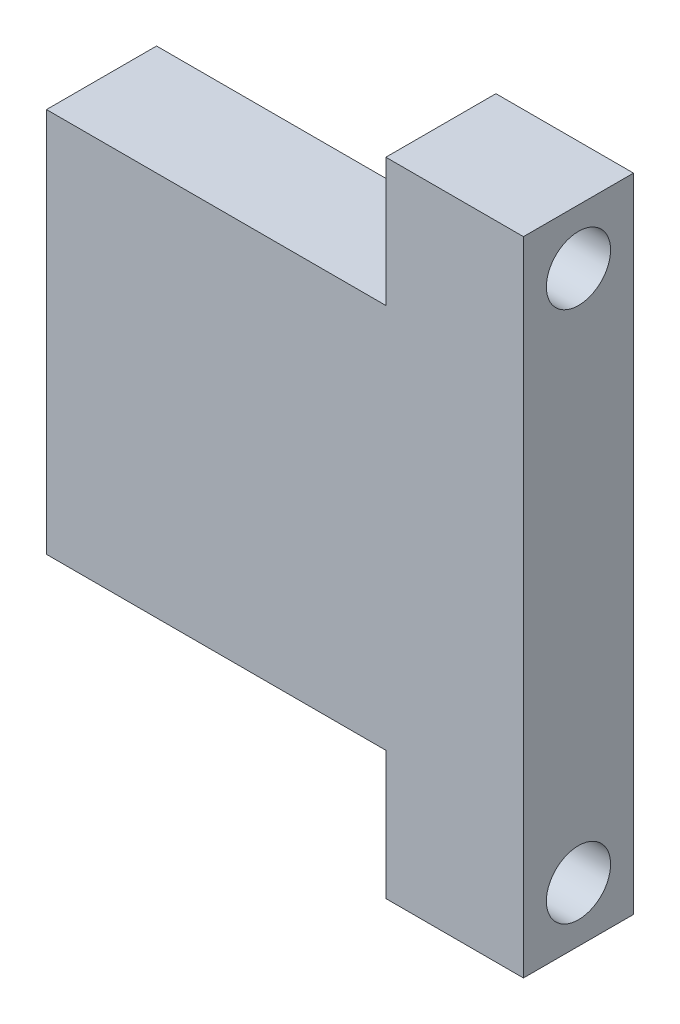
ISO-10303-21;
HEADER;
FILE_DESCRIPTION(('STEP AP214'),'2;1');
FILE_NAME('part.step','',(''),(''),'','','');
FILE_SCHEMA(('AUTOMOTIVE_DESIGN { 1 0 10303 214 1 1 1 1 }'));
ENDSEC;
DATA;
#1=APPLICATION_CONTEXT('core data for automotive mechanical design processes');
#2=APPLICATION_PROTOCOL_DEFINITION('international standard','automotive_design',2000,#1);
#3=PRODUCT_CONTEXT('',#1,'mechanical');
#4=PRODUCT('Part','Part','',(#3));
#5=PRODUCT_RELATED_PRODUCT_CATEGORY('part','',(#4));
#6=PRODUCT_DEFINITION_FORMATION('','',#4);
#7=PRODUCT_DEFINITION_CONTEXT('part definition',#1,'design');
#8=PRODUCT_DEFINITION('design','',#6,#7);
#9=PRODUCT_DEFINITION_SHAPE('','',#8);
#10=(LENGTH_UNIT() NAMED_UNIT(*) SI_UNIT(.MILLI.,.METRE.));
#11=(NAMED_UNIT(*) PLANE_ANGLE_UNIT() SI_UNIT($,.RADIAN.));
#12=(NAMED_UNIT(*) SI_UNIT($,.STERADIAN.) SOLID_ANGLE_UNIT());
#13=UNCERTAINTY_MEASURE_WITH_UNIT(LENGTH_MEASURE(1.E-05),#10,'distance_accuracy_value','');
#14=(GEOMETRIC_REPRESENTATION_CONTEXT(3) GLOBAL_UNCERTAINTY_ASSIGNED_CONTEXT((#13)) GLOBAL_UNIT_ASSIGNED_CONTEXT((#10,
#11,#12)) REPRESENTATION_CONTEXT('',''));
#15=CARTESIAN_POINT('',(0.,0.,0.));
#16=DIRECTION('',(0.,0.,1.));
#17=DIRECTION('',(1.,0.,0.));
#18=AXIS2_PLACEMENT_3D('',#15,#16,#17);
#19=CARTESIAN_POINT('',(0.,-35.,-12.));
#20=DIRECTION('',(1.,0.,0.));
#21=DIRECTION('',(0.,0.,-1.));
#22=AXIS2_PLACEMENT_3D('',#19,#20,#21);
#23=PLANE('',#22);
#24=CARTESIAN_POINT('',(0.,29.,-6.));
#25=DIRECTION('',(1.,0.,0.));
#26=DIRECTION('',(0.,0.,-1.));
#27=AXIS2_PLACEMENT_3D('',#24,#25,#26);
#28=CIRCLE('',#27,3.49999999999999);
#29=CARTESIAN_POINT('',(0.,29.,-9.49999999999999));
#30=VERTEX_POINT('',#29);
#31=EDGE_CURVE('E39',#30,#30,#28,.T.);
#32=ORIENTED_EDGE('',*,*,#31,.F.);
#33=EDGE_LOOP('',(#32));
#34=FACE_BOUND('',#33,.T.);
#35=CARTESIAN_POINT('',(0.,-29.,-6.));
#36=DIRECTION('',(1.,0.,0.));
#37=DIRECTION('',(0.,0.,-1.));
#38=AXIS2_PLACEMENT_3D('',#35,#36,#37);
#39=CIRCLE('',#38,3.49999999999999);
#40=CARTESIAN_POINT('',(0.,-29.,-9.49999999999999));
#41=VERTEX_POINT('',#40);
#42=EDGE_CURVE('E135',#41,#41,#39,.T.);
#43=ORIENTED_EDGE('',*,*,#42,.F.);
#44=EDGE_LOOP('',(#43));
#45=FACE_BOUND('',#44,.T.);
#46=DIRECTION('',(0.,1.,0.));
#47=VECTOR('',#46,1.);
#48=CARTESIAN_POINT('',(0.,-35.,0.));
#49=LINE('',#48,#47);
#50=CARTESIAN_POINT('',(0.,-35.,0.));
#51=VERTEX_POINT('',#50);
#52=CARTESIAN_POINT('',(0.,35.,0.));
#53=VERTEX_POINT('',#52);
#54=EDGE_CURVE('E167',#51,#53,#49,.T.);
#55=ORIENTED_EDGE('',*,*,#54,.F.);
#56=DIRECTION('',(0.,0.,1.));
#57=VECTOR('',#56,1.);
#58=CARTESIAN_POINT('',(0.,-35.,-12.));
#59=LINE('',#58,#57);
#60=CARTESIAN_POINT('',(0.,-35.,-12.));
#61=VERTEX_POINT('',#60);
#62=EDGE_CURVE('E11',#61,#51,#59,.T.);
#63=ORIENTED_EDGE('',*,*,#62,.F.);
#64=DIRECTION('',(0.,1.,0.));
#65=VECTOR('',#64,1.);
#66=CARTESIAN_POINT('',(0.,-35.,-12.));
#67=LINE('',#66,#65);
#68=CARTESIAN_POINT('',(0.,35.,-12.));
#69=VERTEX_POINT('',#68);
#70=EDGE_CURVE('E171',#61,#69,#67,.T.);
#71=ORIENTED_EDGE('',*,*,#70,.T.);
#72=DIRECTION('',(0.,0.,1.));
#73=VECTOR('',#72,1.);
#74=CARTESIAN_POINT('',(0.,35.,-12.));
#75=LINE('',#74,#73);
#76=EDGE_CURVE('E44',#69,#53,#75,.T.);
#77=ORIENTED_EDGE('',*,*,#76,.T.);
#78=EDGE_LOOP('',(#55,#63,#71,#77));
#79=FACE_BOUND('',#78,.T.);
#80=ADVANCED_FACE('F36',(#34,#45,#79),#23,.T.);
#81=CARTESIAN_POINT('',(0.,-35.,-12.));
#82=DIRECTION('',(0.,-1.,0.));
#83=DIRECTION('',(1.,0.,0.));
#84=AXIS2_PLACEMENT_3D('',#81,#82,#83);
#85=PLANE('',#84);
#86=DIRECTION('',(0.,0.,1.));
#87=VECTOR('',#86,1.);
#88=CARTESIAN_POINT('',(-15.,-35.,-12.));
#89=LINE('',#88,#87);
#90=CARTESIAN_POINT('',(-15.,-35.,-12.));
#91=VERTEX_POINT('',#90);
#92=CARTESIAN_POINT('',(-15.,-35.,0.));
#93=VERTEX_POINT('',#92);
#94=EDGE_CURVE('E52',#91,#93,#89,.T.);
#95=ORIENTED_EDGE('',*,*,#94,.F.);
#96=DIRECTION('',(1.,0.,0.));
#97=VECTOR('',#96,1.);
#98=CARTESIAN_POINT('',(0.,-35.,-12.));
#99=LINE('',#98,#97);
#100=EDGE_CURVE('E181',#91,#61,#99,.T.);
#101=ORIENTED_EDGE('',*,*,#100,.T.);
#102=ORIENTED_EDGE('',*,*,#62,.T.);
#103=DIRECTION('',(1.,0.,0.));
#104=VECTOR('',#103,1.);
#105=CARTESIAN_POINT('',(0.,-35.,0.));
#106=LINE('',#105,#104);
#107=EDGE_CURVE('E175',#93,#51,#106,.T.);
#108=ORIENTED_EDGE('',*,*,#107,.F.);
#109=EDGE_LOOP('',(#95,#101,#102,#108));
#110=FACE_BOUND('',#109,.T.);
#111=ADVANCED_FACE('F205',(#110),#85,.T.);
#112=CARTESIAN_POINT('',(-52.,-35.,-12.));
#113=DIRECTION('',(-1.,0.,0.));
#114=DIRECTION('',(0.,0.,1.));
#115=AXIS2_PLACEMENT_3D('',#112,#113,#114);
#116=PLANE('',#115);
#117=CARTESIAN_POINT('',(-52.,14.,-6.));
#118=DIRECTION('',(-1.,0.,0.));
#119=DIRECTION('',(0.,0.,1.));
#120=AXIS2_PLACEMENT_3D('',#117,#118,#119);
#121=CIRCLE('',#120,2.49999999999999);
#122=CARTESIAN_POINT('',(-52.,14.,-3.50000000000001));
#123=VERTEX_POINT('',#122);
#124=EDGE_CURVE('E119',#123,#123,#121,.T.);
#125=ORIENTED_EDGE('',*,*,#124,.F.);
#126=EDGE_LOOP('',(#125));
#127=FACE_BOUND('',#126,.T.);
#128=CARTESIAN_POINT('',(-52.,-14.,-6.));
#129=DIRECTION('',(-1.,0.,0.));
#130=DIRECTION('',(0.,0.,1.));
#131=AXIS2_PLACEMENT_3D('',#128,#129,#130);
#132=CIRCLE('',#131,2.49999999999999);
#133=CARTESIAN_POINT('',(-52.,-14.,-3.50000000000001));
#134=VERTEX_POINT('',#133);
#135=EDGE_CURVE('E118',#134,#134,#132,.T.);
#136=ORIENTED_EDGE('',*,*,#135,.F.);
#137=EDGE_LOOP('',(#136));
#138=FACE_BOUND('',#137,.T.);
#139=DIRECTION('',(0.,0.,1.));
#140=VECTOR('',#139,1.);
#141=CARTESIAN_POINT('',(-52.,-21.,-12.));
#142=LINE('',#141,#140);
#143=CARTESIAN_POINT('',(-52.,-21.,-12.));
#144=VERTEX_POINT('',#143);
#145=CARTESIAN_POINT('',(-52.,-21.,0.));
#146=VERTEX_POINT('',#145);
#147=EDGE_CURVE('E148',#144,#146,#142,.T.);
#148=ORIENTED_EDGE('',*,*,#147,.T.);
#149=DIRECTION('',(0.,-1.,0.));
#150=VECTOR('',#149,1.);
#151=CARTESIAN_POINT('',(-52.,-35.,0.));
#152=LINE('',#151,#150);
#153=CARTESIAN_POINT('',(-52.,21.,0.));
#154=VERTEX_POINT('',#153);
#155=EDGE_CURVE('E188',#154,#146,#152,.T.);
#156=ORIENTED_EDGE('',*,*,#155,.F.);
#157=DIRECTION('',(0.,0.,1.));
#158=VECTOR('',#157,1.);
#159=CARTESIAN_POINT('',(-52.,21.,-12.));
#160=LINE('',#159,#158);
#161=CARTESIAN_POINT('',(-52.,21.,-12.));
#162=VERTEX_POINT('',#161);
#163=EDGE_CURVE('E60',#162,#154,#160,.T.);
#164=ORIENTED_EDGE('',*,*,#163,.F.);
#165=DIRECTION('',(0.,-1.,0.));
#166=VECTOR('',#165,1.);
#167=CARTESIAN_POINT('',(-52.,-35.,-12.));
#168=LINE('',#167,#166);
#169=EDGE_CURVE('E178',#162,#144,#168,.T.);
#170=ORIENTED_EDGE('',*,*,#169,.T.);
#171=EDGE_LOOP('',(#148,#156,#164,#170));
#172=FACE_BOUND('',#171,.T.);
#173=ADVANCED_FACE('F215',(#127,#138,#172),#116,.T.);
#174=CARTESIAN_POINT('',(0.,35.,-12.));
#175=DIRECTION('',(0.,1.,0.));
#176=DIRECTION('',(-1.,0.,0.));
#177=AXIS2_PLACEMENT_3D('',#174,#175,#176);
#178=PLANE('',#177);
#179=DIRECTION('',(0.,0.,1.));
#180=VECTOR('',#179,1.);
#181=CARTESIAN_POINT('',(-15.,35.,-12.));
#182=LINE('',#181,#180);
#183=CARTESIAN_POINT('',(-15.,35.,-12.));
#184=VERTEX_POINT('',#183);
#185=CARTESIAN_POINT('',(-15.,35.,0.));
#186=VERTEX_POINT('',#185);
#187=EDGE_CURVE('E164',#184,#186,#182,.T.);
#188=ORIENTED_EDGE('',*,*,#187,.T.);
#189=DIRECTION('',(-1.,0.,0.));
#190=VECTOR('',#189,1.);
#191=CARTESIAN_POINT('',(0.,35.,0.));
#192=LINE('',#191,#190);
#193=EDGE_CURVE('E185',#53,#186,#192,.T.);
#194=ORIENTED_EDGE('',*,*,#193,.F.);
#195=ORIENTED_EDGE('',*,*,#76,.F.);
#196=DIRECTION('',(-1.,0.,0.));
#197=VECTOR('',#196,1.);
#198=CARTESIAN_POINT('',(0.,35.,-12.));
#199=LINE('',#198,#197);
#200=EDGE_CURVE('E174',#69,#184,#199,.T.);
#201=ORIENTED_EDGE('',*,*,#200,.T.);
#202=EDGE_LOOP('',(#188,#194,#195,#201));
#203=FACE_BOUND('',#202,.T.);
#204=ADVANCED_FACE('F198',(#203),#178,.T.);
#205=CARTESIAN_POINT('',(0.,35.,-12.));
#206=DIRECTION('',(0.,0.,1.));
#207=DIRECTION('',(1.,0.,0.));
#208=AXIS2_PLACEMENT_3D('',#205,#206,#207);
#209=PLANE('',#208);
#210=DIRECTION('',(0.,1.,0.));
#211=VECTOR('',#210,1.);
#212=CARTESIAN_POINT('',(-15.,-35.,-12.));
#213=LINE('',#212,#211);
#214=CARTESIAN_POINT('',(-15.,-21.,-12.));
#215=VERTEX_POINT('',#214);
#216=EDGE_CURVE('E139',#91,#215,#213,.T.);
#217=ORIENTED_EDGE('',*,*,#216,.T.);
#218=DIRECTION('',(-1.,0.,0.));
#219=VECTOR('',#218,1.);
#220=CARTESIAN_POINT('',(-52.,-21.,-12.));
#221=LINE('',#220,#219);
#222=EDGE_CURVE('E142',#215,#144,#221,.T.);
#223=ORIENTED_EDGE('',*,*,#222,.T.);
#224=ORIENTED_EDGE('',*,*,#169,.F.);
#225=DIRECTION('',(1.,0.,0.));
#226=VECTOR('',#225,1.);
#227=CARTESIAN_POINT('',(-52.,21.,-12.));
#228=LINE('',#227,#226);
#229=CARTESIAN_POINT('',(-15.,21.,-12.));
#230=VERTEX_POINT('',#229);
#231=EDGE_CURVE('E155',#162,#230,#228,.T.);
#232=ORIENTED_EDGE('',*,*,#231,.T.);
#233=DIRECTION('',(0.,1.,0.));
#234=VECTOR('',#233,1.);
#235=CARTESIAN_POINT('',(-15.,35.,-12.));
#236=LINE('',#235,#234);
#237=EDGE_CURVE('E158',#230,#184,#236,.T.);
#238=ORIENTED_EDGE('',*,*,#237,.T.);
#239=ORIENTED_EDGE('',*,*,#200,.F.);
#240=ORIENTED_EDGE('',*,*,#70,.F.);
#241=ORIENTED_EDGE('',*,*,#100,.F.);
#242=EDGE_LOOP('',(#217,#223,#224,#232,#238,#239,#240,#241));
#243=FACE_BOUND('',#242,.T.);
#244=ADVANCED_FACE('F208',(#243),#209,.F.);
#245=CARTESIAN_POINT('',(0.,35.,0.));
#246=DIRECTION('',(0.,0.,1.));
#247=DIRECTION('',(1.,0.,0.));
#248=AXIS2_PLACEMENT_3D('',#245,#246,#247);
#249=PLANE('',#248);
#250=DIRECTION('',(-1.,0.,0.));
#251=VECTOR('',#250,1.);
#252=CARTESIAN_POINT('',(-52.,-21.,0.));
#253=LINE('',#252,#251);
#254=CARTESIAN_POINT('',(-15.,-21.,0.));
#255=VERTEX_POINT('',#254);
#256=EDGE_CURVE('E143',#255,#146,#253,.T.);
#257=ORIENTED_EDGE('',*,*,#256,.F.);
#258=DIRECTION('',(0.,1.,0.));
#259=VECTOR('',#258,1.);
#260=CARTESIAN_POINT('',(-15.,-35.,0.));
#261=LINE('',#260,#259);
#262=EDGE_CURVE('E138',#93,#255,#261,.T.);
#263=ORIENTED_EDGE('',*,*,#262,.F.);
#264=ORIENTED_EDGE('',*,*,#107,.T.);
#265=ORIENTED_EDGE('',*,*,#54,.T.);
#266=ORIENTED_EDGE('',*,*,#193,.T.);
#267=DIRECTION('',(0.,1.,0.));
#268=VECTOR('',#267,1.);
#269=CARTESIAN_POINT('',(-15.,35.,0.));
#270=LINE('',#269,#268);
#271=CARTESIAN_POINT('',(-15.,21.,0.));
#272=VERTEX_POINT('',#271);
#273=EDGE_CURVE('E159',#272,#186,#270,.T.);
#274=ORIENTED_EDGE('',*,*,#273,.F.);
#275=DIRECTION('',(1.,0.,0.));
#276=VECTOR('',#275,1.);
#277=CARTESIAN_POINT('',(-52.,21.,0.));
#278=LINE('',#277,#276);
#279=EDGE_CURVE('E151',#154,#272,#278,.T.);
#280=ORIENTED_EDGE('',*,*,#279,.F.);
#281=ORIENTED_EDGE('',*,*,#155,.T.);
#282=EDGE_LOOP('',(#257,#263,#264,#265,#266,#274,#280,#281));
#283=FACE_BOUND('',#282,.T.);
#284=ADVANCED_FACE('F202',(#283),#249,.T.);
#285=CARTESIAN_POINT('',(-15.,35.,-12.));
#286=DIRECTION('',(1.,0.,0.));
#287=DIRECTION('',(0.,1.,0.));
#288=AXIS2_PLACEMENT_3D('',#285,#286,#287);
#289=PLANE('',#288);
#290=CARTESIAN_POINT('',(-15.,29.,-6.));
#291=DIRECTION('',(-1.,0.,0.));
#292=DIRECTION('',(0.,0.,1.));
#293=AXIS2_PLACEMENT_3D('',#290,#291,#292);
#294=CIRCLE('',#293,3.5);
#295=CARTESIAN_POINT('',(-15.,29.,-2.5));
#296=VERTEX_POINT('',#295);
#297=EDGE_CURVE('E129',#296,#296,#294,.T.);
#298=ORIENTED_EDGE('',*,*,#297,.F.);
#299=EDGE_LOOP('',(#298));
#300=FACE_BOUND('',#299,.T.);
#301=ORIENTED_EDGE('',*,*,#273,.T.);
#302=ORIENTED_EDGE('',*,*,#187,.F.);
#303=ORIENTED_EDGE('',*,*,#237,.F.);
#304=DIRECTION('',(0.,0.,1.));
#305=VECTOR('',#304,1.);
#306=CARTESIAN_POINT('',(-15.,21.,-12.));
#307=LINE('',#306,#305);
#308=EDGE_CURVE('E168',#230,#272,#307,.T.);
#309=ORIENTED_EDGE('',*,*,#308,.T.);
#310=EDGE_LOOP('',(#301,#302,#303,#309));
#311=FACE_BOUND('',#310,.T.);
#312=ADVANCED_FACE('F212',(#300,#311),#289,.F.);
#313=CARTESIAN_POINT('',(-52.,21.,-12.));
#314=DIRECTION('',(0.,-1.,0.));
#315=DIRECTION('',(1.,0.,0.));
#316=AXIS2_PLACEMENT_3D('',#313,#314,#315);
#317=PLANE('',#316);
#318=ORIENTED_EDGE('',*,*,#279,.T.);
#319=ORIENTED_EDGE('',*,*,#308,.F.);
#320=ORIENTED_EDGE('',*,*,#231,.F.);
#321=ORIENTED_EDGE('',*,*,#163,.T.);
#322=EDGE_LOOP('',(#318,#319,#320,#321));
#323=FACE_BOUND('',#322,.T.);
#324=ADVANCED_FACE('F231',(#323),#317,.F.);
#325=CARTESIAN_POINT('',(-52.,-21.,-12.));
#326=DIRECTION('',(0.,1.,0.));
#327=DIRECTION('',(-1.,0.,0.));
#328=AXIS2_PLACEMENT_3D('',#325,#326,#327);
#329=PLANE('',#328);
#330=ORIENTED_EDGE('',*,*,#256,.T.);
#331=ORIENTED_EDGE('',*,*,#147,.F.);
#332=ORIENTED_EDGE('',*,*,#222,.F.);
#333=DIRECTION('',(0.,0.,1.));
#334=VECTOR('',#333,1.);
#335=CARTESIAN_POINT('',(-15.,-21.,-12.));
#336=LINE('',#335,#334);
#337=EDGE_CURVE('E152',#215,#255,#336,.T.);
#338=ORIENTED_EDGE('',*,*,#337,.T.);
#339=EDGE_LOOP('',(#330,#331,#332,#338));
#340=FACE_BOUND('',#339,.T.);
#341=ADVANCED_FACE('F218',(#340),#329,.F.);
#342=CARTESIAN_POINT('',(-15.,-35.,-12.));
#343=DIRECTION('',(1.,0.,0.));
#344=DIRECTION('',(0.,1.,0.));
#345=AXIS2_PLACEMENT_3D('',#342,#343,#344);
#346=PLANE('',#345);
#347=CARTESIAN_POINT('',(-15.,-29.,-6.));
#348=DIRECTION('',(-1.,0.,0.));
#349=DIRECTION('',(0.,0.,1.));
#350=AXIS2_PLACEMENT_3D('',#347,#348,#349);
#351=CIRCLE('',#350,3.49999999999999);
#352=CARTESIAN_POINT('',(-15.,-29.,-2.50000000000001));
#353=VERTEX_POINT('',#352);
#354=EDGE_CURVE('E132',#353,#353,#351,.T.);
#355=ORIENTED_EDGE('',*,*,#354,.F.);
#356=EDGE_LOOP('',(#355));
#357=FACE_BOUND('',#356,.T.);
#358=ORIENTED_EDGE('',*,*,#262,.T.);
#359=ORIENTED_EDGE('',*,*,#337,.F.);
#360=ORIENTED_EDGE('',*,*,#216,.F.);
#361=ORIENTED_EDGE('',*,*,#94,.T.);
#362=EDGE_LOOP('',(#358,#359,#360,#361));
#363=FACE_BOUND('',#362,.T.);
#364=ADVANCED_FACE('F219',(#357,#363),#346,.F.);
#365=CARTESIAN_POINT('',(-15.,-29.,-6.));
#366=DIRECTION('',(-1.,0.,0.));
#367=DIRECTION('',(0.,0.,1.));
#368=AXIS2_PLACEMENT_3D('',#365,#366,#367);
#369=CYLINDRICAL_SURFACE('',#368,3.49999999999999);
#370=ORIENTED_EDGE('',*,*,#42,.T.);
#371=EDGE_LOOP('',(#370));
#372=FACE_BOUND('',#371,.T.);
#373=ORIENTED_EDGE('',*,*,#354,.T.);
#374=EDGE_LOOP('',(#373));
#375=FACE_BOUND('',#374,.T.);
#376=ADVANCED_FACE('F221',(#372,#375),#369,.F.);
#377=CARTESIAN_POINT('',(-15.,29.,-6.));
#378=DIRECTION('',(-1.,0.,0.));
#379=DIRECTION('',(0.,0.,1.));
#380=AXIS2_PLACEMENT_3D('',#377,#378,#379);
#381=CYLINDRICAL_SURFACE('',#380,3.49999999999999);
#382=ORIENTED_EDGE('',*,*,#31,.T.);
#383=EDGE_LOOP('',(#382));
#384=FACE_BOUND('',#383,.T.);
#385=ORIENTED_EDGE('',*,*,#297,.T.);
#386=EDGE_LOOP('',(#385));
#387=FACE_BOUND('',#386,.T.);
#388=ADVANCED_FACE('F228',(#384,#387),#381,.F.);
#389=CARTESIAN_POINT('',(-34.,-14.,-6.));
#390=DIRECTION('',(-1.,0.,0.));
#391=DIRECTION('',(0.,0.,1.));
#392=AXIS2_PLACEMENT_3D('',#389,#390,#391);
#393=CONICAL_SURFACE('',#392,2.5,1.02974425867665);
#394=CARTESIAN_POINT('',(-32.4978484524311,-14.,-6.));
#395=VERTEX_POINT('',#394);
#396=VERTEX_LOOP('',#395);
#397=FACE_BOUND('',#396,.T.);
#398=CARTESIAN_POINT('',(-34.,-14.,-6.));
#399=DIRECTION('',(-1.,0.,0.));
#400=DIRECTION('',(0.,0.,1.));
#401=AXIS2_PLACEMENT_3D('',#398,#399,#400);
#402=CIRCLE('',#401,2.5);
#403=CARTESIAN_POINT('',(-34.,-14.,-3.5));
#404=VERTEX_POINT('',#403);
#405=EDGE_CURVE('E122',#404,#404,#402,.T.);
#406=ORIENTED_EDGE('',*,*,#405,.T.);
#407=EDGE_LOOP('',(#406));
#408=FACE_BOUND('',#407,.T.);
#409=ADVANCED_FACE('F249',(#397,#408),#393,.F.);
#410=CARTESIAN_POINT('',(-52.,-14.,-6.));
#411=DIRECTION('',(-1.,0.,0.));
#412=DIRECTION('',(0.,0.,1.));
#413=AXIS2_PLACEMENT_3D('',#410,#411,#412);
#414=CYLINDRICAL_SURFACE('',#413,2.49999999999999);
#415=ORIENTED_EDGE('',*,*,#405,.F.);
#416=EDGE_LOOP('',(#415));
#417=FACE_BOUND('',#416,.T.);
#418=ORIENTED_EDGE('',*,*,#135,.T.);
#419=EDGE_LOOP('',(#418));
#420=FACE_BOUND('',#419,.T.);
#421=ADVANCED_FACE('F112',(#417,#420),#414,.F.);
#422=CARTESIAN_POINT('',(-34.,14.,-6.));
#423=DIRECTION('',(-1.,0.,0.));
#424=DIRECTION('',(0.,0.,1.));
#425=AXIS2_PLACEMENT_3D('',#422,#423,#424);
#426=CONICAL_SURFACE('',#425,2.5,1.02974425867665);
#427=CARTESIAN_POINT('',(-32.4978484524311,14.,-6.));
#428=VERTEX_POINT('',#427);
#429=VERTEX_LOOP('',#428);
#430=FACE_BOUND('',#429,.T.);
#431=CARTESIAN_POINT('',(-34.,14.,-6.));
#432=DIRECTION('',(-1.,0.,0.));
#433=DIRECTION('',(0.,0.,1.));
#434=AXIS2_PLACEMENT_3D('',#431,#432,#433);
#435=CIRCLE('',#434,2.5);
#436=CARTESIAN_POINT('',(-34.,14.,-3.5));
#437=VERTEX_POINT('',#436);
#438=EDGE_CURVE('E116',#437,#437,#435,.T.);
#439=ORIENTED_EDGE('',*,*,#438,.T.);
#440=EDGE_LOOP('',(#439));
#441=FACE_BOUND('',#440,.T.);
#442=ADVANCED_FACE('F108',(#430,#441),#426,.F.);
#443=CARTESIAN_POINT('',(-52.,14.,-6.));
#444=DIRECTION('',(-1.,0.,0.));
#445=DIRECTION('',(0.,0.,1.));
#446=AXIS2_PLACEMENT_3D('',#443,#444,#445);
#447=CYLINDRICAL_SURFACE('',#446,2.49999999999999);
#448=ORIENTED_EDGE('',*,*,#438,.F.);
#449=EDGE_LOOP('',(#448));
#450=FACE_BOUND('',#449,.T.);
#451=ORIENTED_EDGE('',*,*,#124,.T.);
#452=EDGE_LOOP('',(#451));
#453=FACE_BOUND('',#452,.T.);
#454=ADVANCED_FACE('F111',(#450,#453),#447,.F.);
#455=CLOSED_SHELL('',(#80,#111,#173,#204,#244,#284,#312,#324,#341,#364,#376,#388,#409,#421,#442,#454));
#456=MANIFOLD_SOLID_BREP('B2',#455);
#457=ADVANCED_BREP_SHAPE_REPRESENTATION('',(#18,#456),#14);
#458=SHAPE_DEFINITION_REPRESENTATION(#9,#457);
ENDSEC;
END-ISO-10303-21;
